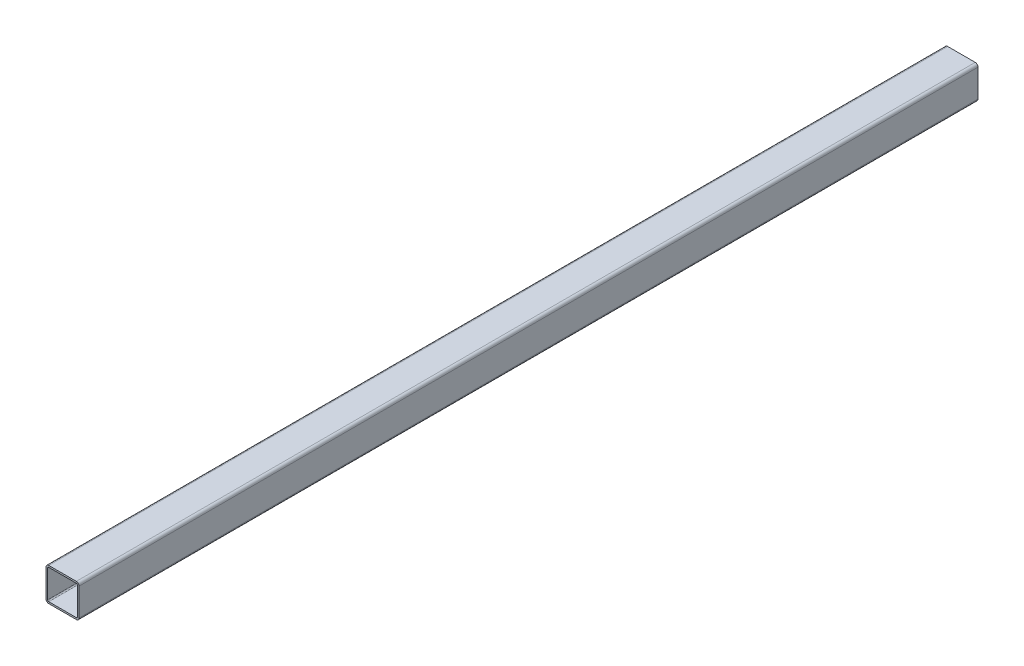
ISO-10303-21;
HEADER;
FILE_DESCRIPTION(('STEP AP214'),'2;1');
FILE_NAME('part.step','',(''),(''),'','','');
FILE_SCHEMA(('AUTOMOTIVE_DESIGN { 1 0 10303 214 1 1 1 1 }'));
ENDSEC;
DATA;
#1=APPLICATION_CONTEXT('core data for automotive mechanical design processes');
#2=APPLICATION_PROTOCOL_DEFINITION('international standard','automotive_design',2000,#1);
#3=PRODUCT_CONTEXT('',#1,'mechanical');
#4=PRODUCT('Part','Part','',(#3));
#5=PRODUCT_RELATED_PRODUCT_CATEGORY('part','',(#4));
#6=PRODUCT_DEFINITION_FORMATION('','',#4);
#7=PRODUCT_DEFINITION_CONTEXT('part definition',#1,'design');
#8=PRODUCT_DEFINITION('design','',#6,#7);
#9=PRODUCT_DEFINITION_SHAPE('','',#8);
#10=(LENGTH_UNIT() NAMED_UNIT(*) SI_UNIT(.MILLI.,.METRE.));
#11=(NAMED_UNIT(*) PLANE_ANGLE_UNIT() SI_UNIT($,.RADIAN.));
#12=(NAMED_UNIT(*) SI_UNIT($,.STERADIAN.) SOLID_ANGLE_UNIT());
#13=UNCERTAINTY_MEASURE_WITH_UNIT(LENGTH_MEASURE(1.E-05),#10,'distance_accuracy_value','');
#14=(GEOMETRIC_REPRESENTATION_CONTEXT(3) GLOBAL_UNCERTAINTY_ASSIGNED_CONTEXT((#13)) GLOBAL_UNIT_ASSIGNED_CONTEXT((#10,
#11,#12)) REPRESENTATION_CONTEXT('',''));
#15=CARTESIAN_POINT('',(0.,0.,0.));
#16=DIRECTION('',(0.,0.,1.));
#17=DIRECTION('',(1.,0.,0.));
#18=AXIS2_PLACEMENT_3D('',#15,#16,#17);
#19=CARTESIAN_POINT('',(25.,25.,815.));
#20=DIRECTION('',(0.,0.,-1.));
#21=DIRECTION('',(-1.,0.,0.));
#22=AXIS2_PLACEMENT_3D('',#19,#20,#21);
#23=PLANE('',#22);
#24=CARTESIAN_POINT('',(25.,25.,815.));
#25=DIRECTION('',(0.,0.,1.));
#26=DIRECTION('',(-1.,0.,0.));
#27=AXIS2_PLACEMENT_3D('',#24,#25,#26);
#28=CIRCLE('',#27,5.00000000000013);
#29=CARTESIAN_POINT('',(30.,25.,815.));
#30=VERTEX_POINT('',#29);
#31=CARTESIAN_POINT('',(24.9999999999995,30.0000000000002,815.));
#32=VERTEX_POINT('',#31);
#33=EDGE_CURVE('E198',#30,#32,#28,.T.);
#34=ORIENTED_EDGE('',*,*,#33,.T.);
#35=DIRECTION('',(-1.,0.,0.));
#36=VECTOR('',#35,1.);
#37=CARTESIAN_POINT('',(-24.9999999999995,30.0000000000002,815.));
#38=LINE('',#37,#36);
#39=CARTESIAN_POINT('',(-24.9999999999995,30.0000000000002,815.));
#40=VERTEX_POINT('',#39);
#41=EDGE_CURVE('E201',#32,#40,#38,.T.);
#42=ORIENTED_EDGE('',*,*,#41,.T.);
#43=CARTESIAN_POINT('',(-25.,25.,815.));
#44=DIRECTION('',(0.,0.,1.));
#45=DIRECTION('',(-1.,0.,0.));
#46=AXIS2_PLACEMENT_3D('',#43,#44,#45);
#47=CIRCLE('',#46,5.00000000000013);
#48=CARTESIAN_POINT('',(-30.0000000000001,25.,815.));
#49=VERTEX_POINT('',#48);
#50=EDGE_CURVE('E204',#40,#49,#47,.T.);
#51=ORIENTED_EDGE('',*,*,#50,.T.);
#52=DIRECTION('',(0.,-1.,0.));
#53=VECTOR('',#52,1.);
#54=CARTESIAN_POINT('',(-30.,-25.,815.));
#55=LINE('',#54,#53);
#56=CARTESIAN_POINT('',(-30.,-25.,815.));
#57=VERTEX_POINT('',#56);
#58=EDGE_CURVE('E206',#49,#57,#55,.T.);
#59=ORIENTED_EDGE('',*,*,#58,.T.);
#60=CARTESIAN_POINT('',(-25.,-25.,815.));
#61=DIRECTION('',(0.,0.,1.));
#62=DIRECTION('',(-1.,0.,0.));
#63=AXIS2_PLACEMENT_3D('',#60,#61,#62);
#64=CIRCLE('',#63,5.00000000000013);
#65=CARTESIAN_POINT('',(-24.9999999999995,-30.0000000000001,815.));
#66=VERTEX_POINT('',#65);
#67=EDGE_CURVE('E208',#57,#66,#64,.T.);
#68=ORIENTED_EDGE('',*,*,#67,.T.);
#69=DIRECTION('',(1.,0.,0.));
#70=VECTOR('',#69,1.);
#71=CARTESIAN_POINT('',(-24.9999999999995,-30.0000000000002,815.));
#72=LINE('',#71,#70);
#73=CARTESIAN_POINT('',(24.9999999999995,-30.0000000000002,815.));
#74=VERTEX_POINT('',#73);
#75=EDGE_CURVE('E210',#66,#74,#72,.T.);
#76=ORIENTED_EDGE('',*,*,#75,.T.);
#77=CARTESIAN_POINT('',(25.,-25.,815.));
#78=DIRECTION('',(0.,0.,1.));
#79=DIRECTION('',(1.,0.,0.));
#80=AXIS2_PLACEMENT_3D('',#77,#78,#79);
#81=CIRCLE('',#80,5.00000000000013);
#82=CARTESIAN_POINT('',(30.0000000000001,-25.,815.));
#83=VERTEX_POINT('',#82);
#84=EDGE_CURVE('E212',#74,#83,#81,.T.);
#85=ORIENTED_EDGE('',*,*,#84,.T.);
#86=DIRECTION('',(0.,1.,0.));
#87=VECTOR('',#86,1.);
#88=CARTESIAN_POINT('',(30.,-25.,815.));
#89=LINE('',#88,#87);
#90=EDGE_CURVE('E214',#83,#30,#89,.T.);
#91=ORIENTED_EDGE('',*,*,#90,.T.);
#92=EDGE_LOOP('',(#34,#42,#51,#59,#68,#76,#85,#91));
#93=FACE_BOUND('',#92,.T.);
#94=CARTESIAN_POINT('',(25.,25.,815.));
#95=DIRECTION('',(0.,0.,-1.));
#96=DIRECTION('',(-1.,0.,0.));
#97=AXIS2_PLACEMENT_3D('',#94,#95,#96);
#98=CIRCLE('',#97,2.00000000000013);
#99=CARTESIAN_POINT('',(27.,25.,815.));
#100=VERTEX_POINT('',#99);
#101=CARTESIAN_POINT('',(24.9999999999995,27.0000000000002,815.));
#102=VERTEX_POINT('',#101);
#103=EDGE_CURVE('E169',#100,#102,#98,.F.);
#104=ORIENTED_EDGE('',*,*,#103,.F.);
#105=DIRECTION('',(0.,1.,0.));
#106=VECTOR('',#105,1.);
#107=CARTESIAN_POINT('',(27.,25.,815.));
#108=LINE('',#107,#106);
#109=CARTESIAN_POINT('',(27.0000000000001,-25.,815.));
#110=VERTEX_POINT('',#109);
#111=EDGE_CURVE('E151',#110,#100,#108,.T.);
#112=ORIENTED_EDGE('',*,*,#111,.F.);
#113=CARTESIAN_POINT('',(25.,-25.,815.));
#114=DIRECTION('',(0.,0.,-1.));
#115=DIRECTION('',(-1.,0.,0.));
#116=AXIS2_PLACEMENT_3D('',#113,#114,#115);
#117=CIRCLE('',#116,2.00000000000013);
#118=CARTESIAN_POINT('',(24.9999999999995,-27.0000000000002,815.));
#119=VERTEX_POINT('',#118);
#120=EDGE_CURVE('E195',#119,#110,#117,.F.);
#121=ORIENTED_EDGE('',*,*,#120,.F.);
#122=DIRECTION('',(1.,0.,0.));
#123=VECTOR('',#122,1.);
#124=CARTESIAN_POINT('',(25.,-27.0000000000002,815.));
#125=LINE('',#124,#123);
#126=CARTESIAN_POINT('',(-24.9999999999998,-27.0000000000001,815.));
#127=VERTEX_POINT('',#126);
#128=EDGE_CURVE('E193',#127,#119,#125,.T.);
#129=ORIENTED_EDGE('',*,*,#128,.F.);
#130=CARTESIAN_POINT('',(-25.,-25.,815.));
#131=DIRECTION('',(0.,0.,-1.));
#132=DIRECTION('',(-1.,0.,0.));
#133=AXIS2_PLACEMENT_3D('',#130,#131,#132);
#134=CIRCLE('',#133,2.00000000000013);
#135=CARTESIAN_POINT('',(-27.,-25.,815.));
#136=VERTEX_POINT('',#135);
#137=EDGE_CURVE('E191',#136,#127,#134,.F.);
#138=ORIENTED_EDGE('',*,*,#137,.F.);
#139=DIRECTION('',(0.,-1.,0.));
#140=VECTOR('',#139,1.);
#141=CARTESIAN_POINT('',(-27.,25.,815.));
#142=LINE('',#141,#140);
#143=CARTESIAN_POINT('',(-27.0000000000001,25.,815.));
#144=VERTEX_POINT('',#143);
#145=EDGE_CURVE('E189',#144,#136,#142,.T.);
#146=ORIENTED_EDGE('',*,*,#145,.F.);
#147=CARTESIAN_POINT('',(-25.,25.,815.));
#148=DIRECTION('',(0.,0.,-1.));
#149=DIRECTION('',(-1.,0.,0.));
#150=AXIS2_PLACEMENT_3D('',#147,#148,#149);
#151=CIRCLE('',#150,2.00000000000013);
#152=CARTESIAN_POINT('',(-24.9999999999995,27.0000000000002,815.));
#153=VERTEX_POINT('',#152);
#154=EDGE_CURVE('E187',#153,#144,#151,.F.);
#155=ORIENTED_EDGE('',*,*,#154,.F.);
#156=DIRECTION('',(-1.,0.,0.));
#157=VECTOR('',#156,1.);
#158=CARTESIAN_POINT('',(25.,27.0000000000002,815.));
#159=LINE('',#158,#157);
#160=EDGE_CURVE('E171',#102,#153,#159,.T.);
#161=ORIENTED_EDGE('',*,*,#160,.F.);
#162=EDGE_LOOP('',(#104,#112,#121,#129,#138,#146,#155,#161));
#163=FACE_BOUND('',#162,.T.);
#164=ADVANCED_FACE('F32',(#93,#163),#23,.F.);
#165=CARTESIAN_POINT('',(25.,25.,-815.));
#166=DIRECTION('',(0.,0.,-1.));
#167=DIRECTION('',(-1.,0.,0.));
#168=AXIS2_PLACEMENT_3D('',#165,#166,#167);
#169=PLANE('',#168);
#170=CARTESIAN_POINT('',(25.,25.,-815.));
#171=DIRECTION('',(0.,0.,1.));
#172=DIRECTION('',(-1.,0.,0.));
#173=AXIS2_PLACEMENT_3D('',#170,#171,#172);
#174=CIRCLE('',#173,5.00000000000013);
#175=CARTESIAN_POINT('',(30.,25.,-815.));
#176=VERTEX_POINT('',#175);
#177=CARTESIAN_POINT('',(24.9999999999995,30.0000000000002,-815.));
#178=VERTEX_POINT('',#177);
#179=EDGE_CURVE('E217',#176,#178,#174,.T.);
#180=ORIENTED_EDGE('',*,*,#179,.F.);
#181=DIRECTION('',(0.,1.,0.));
#182=VECTOR('',#181,1.);
#183=CARTESIAN_POINT('',(30.,-25.,-815.));
#184=LINE('',#183,#182);
#185=CARTESIAN_POINT('',(30.0000000000001,-25.,-815.));
#186=VERTEX_POINT('',#185);
#187=EDGE_CURVE('E202',#186,#176,#184,.T.);
#188=ORIENTED_EDGE('',*,*,#187,.F.);
#189=CARTESIAN_POINT('',(25.,-25.,-815.));
#190=DIRECTION('',(0.,0.,1.));
#191=DIRECTION('',(1.,0.,0.));
#192=AXIS2_PLACEMENT_3D('',#189,#190,#191);
#193=CIRCLE('',#192,5.00000000000013);
#194=CARTESIAN_POINT('',(24.9999999999995,-30.0000000000002,-815.));
#195=VERTEX_POINT('',#194);
#196=EDGE_CURVE('E230',#195,#186,#193,.T.);
#197=ORIENTED_EDGE('',*,*,#196,.F.);
#198=DIRECTION('',(1.,0.,0.));
#199=VECTOR('',#198,1.);
#200=CARTESIAN_POINT('',(-24.9999999999995,-30.0000000000002,-815.));
#201=LINE('',#200,#199);
#202=CARTESIAN_POINT('',(-24.9999999999995,-30.0000000000001,-815.));
#203=VERTEX_POINT('',#202);
#204=EDGE_CURVE('E228',#203,#195,#201,.T.);
#205=ORIENTED_EDGE('',*,*,#204,.F.);
#206=CARTESIAN_POINT('',(-25.,-25.,-815.));
#207=DIRECTION('',(0.,0.,1.));
#208=DIRECTION('',(-1.,0.,0.));
#209=AXIS2_PLACEMENT_3D('',#206,#207,#208);
#210=CIRCLE('',#209,5.00000000000013);
#211=CARTESIAN_POINT('',(-30.,-25.,-815.));
#212=VERTEX_POINT('',#211);
#213=EDGE_CURVE('E226',#212,#203,#210,.T.);
#214=ORIENTED_EDGE('',*,*,#213,.F.);
#215=DIRECTION('',(0.,-1.,0.));
#216=VECTOR('',#215,1.);
#217=CARTESIAN_POINT('',(-30.,-25.,-815.));
#218=LINE('',#217,#216);
#219=CARTESIAN_POINT('',(-30.0000000000001,25.,-815.));
#220=VERTEX_POINT('',#219);
#221=EDGE_CURVE('E224',#220,#212,#218,.T.);
#222=ORIENTED_EDGE('',*,*,#221,.F.);
#223=CARTESIAN_POINT('',(-25.,25.,-815.));
#224=DIRECTION('',(0.,0.,1.));
#225=DIRECTION('',(-1.,0.,0.));
#226=AXIS2_PLACEMENT_3D('',#223,#224,#225);
#227=CIRCLE('',#226,5.00000000000013);
#228=CARTESIAN_POINT('',(-24.9999999999995,30.0000000000002,-815.));
#229=VERTEX_POINT('',#228);
#230=EDGE_CURVE('E222',#229,#220,#227,.T.);
#231=ORIENTED_EDGE('',*,*,#230,.F.);
#232=DIRECTION('',(-1.,0.,0.));
#233=VECTOR('',#232,1.);
#234=CARTESIAN_POINT('',(-24.9999999999995,30.0000000000002,-815.));
#235=LINE('',#234,#233);
#236=EDGE_CURVE('E220',#178,#229,#235,.T.);
#237=ORIENTED_EDGE('',*,*,#236,.F.);
#238=EDGE_LOOP('',(#180,#188,#197,#205,#214,#222,#231,#237));
#239=FACE_BOUND('',#238,.T.);
#240=DIRECTION('',(0.,1.,0.));
#241=VECTOR('',#240,1.);
#242=CARTESIAN_POINT('',(27.,25.,-815.));
#243=LINE('',#242,#241);
#244=CARTESIAN_POINT('',(27.0000000000001,-25.,-815.));
#245=VERTEX_POINT('',#244);
#246=CARTESIAN_POINT('',(27.,25.,-815.));
#247=VERTEX_POINT('',#246);
#248=EDGE_CURVE('E148',#245,#247,#243,.T.);
#249=ORIENTED_EDGE('',*,*,#248,.T.);
#250=CARTESIAN_POINT('',(25.,25.,-815.));
#251=DIRECTION('',(0.,0.,-1.));
#252=DIRECTION('',(-1.,0.,0.));
#253=AXIS2_PLACEMENT_3D('',#250,#251,#252);
#254=CIRCLE('',#253,2.00000000000013);
#255=CARTESIAN_POINT('',(24.9999999999995,27.0000000000002,-815.));
#256=VERTEX_POINT('',#255);
#257=EDGE_CURVE('E157',#247,#256,#254,.F.);
#258=ORIENTED_EDGE('',*,*,#257,.T.);
#259=DIRECTION('',(-1.,0.,0.));
#260=VECTOR('',#259,1.);
#261=CARTESIAN_POINT('',(25.,27.0000000000002,-815.));
#262=LINE('',#261,#260);
#263=CARTESIAN_POINT('',(-24.9999999999995,27.0000000000002,-815.));
#264=VERTEX_POINT('',#263);
#265=EDGE_CURVE('E163',#256,#264,#262,.T.);
#266=ORIENTED_EDGE('',*,*,#265,.T.);
#267=CARTESIAN_POINT('',(-25.,25.,-815.));
#268=DIRECTION('',(0.,0.,-1.));
#269=DIRECTION('',(-1.,0.,0.));
#270=AXIS2_PLACEMENT_3D('',#267,#268,#269);
#271=CIRCLE('',#270,2.00000000000013);
#272=CARTESIAN_POINT('',(-27.0000000000001,25.,-815.));
#273=VERTEX_POINT('',#272);
#274=EDGE_CURVE('E55',#264,#273,#271,.F.);
#275=ORIENTED_EDGE('',*,*,#274,.T.);
#276=DIRECTION('',(0.,-1.,0.));
#277=VECTOR('',#276,1.);
#278=CARTESIAN_POINT('',(-27.,25.,-815.));
#279=LINE('',#278,#277);
#280=CARTESIAN_POINT('',(-27.,-25.,-815.));
#281=VERTEX_POINT('',#280);
#282=EDGE_CURVE('E181',#273,#281,#279,.T.);
#283=ORIENTED_EDGE('',*,*,#282,.T.);
#284=CARTESIAN_POINT('',(-25.,-25.,-815.));
#285=DIRECTION('',(0.,0.,-1.));
#286=DIRECTION('',(-1.,0.,0.));
#287=AXIS2_PLACEMENT_3D('',#284,#285,#286);
#288=CIRCLE('',#287,2.00000000000013);
#289=CARTESIAN_POINT('',(-24.9999999999998,-27.0000000000001,-815.));
#290=VERTEX_POINT('',#289);
#291=EDGE_CURVE('E178',#281,#290,#288,.F.);
#292=ORIENTED_EDGE('',*,*,#291,.T.);
#293=DIRECTION('',(1.,0.,0.));
#294=VECTOR('',#293,1.);
#295=CARTESIAN_POINT('',(25.,-27.0000000000002,-815.));
#296=LINE('',#295,#294);
#297=CARTESIAN_POINT('',(24.9999999999995,-27.0000000000002,-815.));
#298=VERTEX_POINT('',#297);
#299=EDGE_CURVE('E173',#290,#298,#296,.T.);
#300=ORIENTED_EDGE('',*,*,#299,.T.);
#301=CARTESIAN_POINT('',(25.,-25.,-815.));
#302=DIRECTION('',(0.,0.,-1.));
#303=DIRECTION('',(-1.,0.,0.));
#304=AXIS2_PLACEMENT_3D('',#301,#302,#303);
#305=CIRCLE('',#304,2.00000000000013);
#306=EDGE_CURVE('E168',#298,#245,#305,.F.);
#307=ORIENTED_EDGE('',*,*,#306,.T.);
#308=EDGE_LOOP('',(#249,#258,#266,#275,#283,#292,#300,#307));
#309=FACE_BOUND('',#308,.T.);
#310=ADVANCED_FACE('F165',(#239,#309),#169,.T.);
#311=CARTESIAN_POINT('',(25.,25.,815.));
#312=DIRECTION('',(0.,0.,-1.));
#313=DIRECTION('',(-1.,0.,0.));
#314=AXIS2_PLACEMENT_3D('',#311,#312,#313);
#315=CYLINDRICAL_SURFACE('',#314,5.00000000000013);
#316=ORIENTED_EDGE('',*,*,#179,.T.);
#317=DIRECTION('',(0.,0.,-1.));
#318=VECTOR('',#317,1.);
#319=CARTESIAN_POINT('',(24.9999999999995,30.0000000000002,815.));
#320=LINE('',#319,#318);
#321=EDGE_CURVE('E11',#32,#178,#320,.T.);
#322=ORIENTED_EDGE('',*,*,#321,.F.);
#323=ORIENTED_EDGE('',*,*,#33,.F.);
#324=DIRECTION('',(0.,0.,-1.));
#325=VECTOR('',#324,1.);
#326=CARTESIAN_POINT('',(30.,25.,815.));
#327=LINE('',#326,#325);
#328=EDGE_CURVE('E216',#30,#176,#327,.T.);
#329=ORIENTED_EDGE('',*,*,#328,.T.);
#330=EDGE_LOOP('',(#316,#322,#323,#329));
#331=FACE_BOUND('',#330,.T.);
#332=ADVANCED_FACE('F34',(#331),#315,.T.);
#333=CARTESIAN_POINT('',(-24.9999999999995,30.0000000000002,815.));
#334=DIRECTION('',(0.,-1.,0.));
#335=DIRECTION('',(0.,0.,-1.));
#336=AXIS2_PLACEMENT_3D('',#333,#334,#335);
#337=PLANE('',#336);
#338=ORIENTED_EDGE('',*,*,#236,.T.);
#339=DIRECTION('',(0.,0.,-1.));
#340=VECTOR('',#339,1.);
#341=CARTESIAN_POINT('',(-24.9999999999995,30.0000000000002,815.));
#342=LINE('',#341,#340);
#343=EDGE_CURVE('E40',#40,#229,#342,.T.);
#344=ORIENTED_EDGE('',*,*,#343,.F.);
#345=ORIENTED_EDGE('',*,*,#41,.F.);
#346=ORIENTED_EDGE('',*,*,#321,.T.);
#347=EDGE_LOOP('',(#338,#344,#345,#346));
#348=FACE_BOUND('',#347,.T.);
#349=ADVANCED_FACE('F276',(#348),#337,.F.);
#350=CARTESIAN_POINT('',(-25.,25.,815.));
#351=DIRECTION('',(0.,0.,-1.));
#352=DIRECTION('',(-1.,0.,0.));
#353=AXIS2_PLACEMENT_3D('',#350,#351,#352);
#354=CYLINDRICAL_SURFACE('',#353,5.00000000000013);
#355=ORIENTED_EDGE('',*,*,#230,.T.);
#356=DIRECTION('',(0.,0.,-1.));
#357=VECTOR('',#356,1.);
#358=CARTESIAN_POINT('',(-30.0000000000001,25.,815.));
#359=LINE('',#358,#357);
#360=EDGE_CURVE('E247',#49,#220,#359,.T.);
#361=ORIENTED_EDGE('',*,*,#360,.F.);
#362=ORIENTED_EDGE('',*,*,#50,.F.);
#363=ORIENTED_EDGE('',*,*,#343,.T.);
#364=EDGE_LOOP('',(#355,#361,#362,#363));
#365=FACE_BOUND('',#364,.T.);
#366=ADVANCED_FACE('F254',(#365),#354,.T.);
#367=CARTESIAN_POINT('',(-30.,-25.,815.));
#368=DIRECTION('',(1.,0.,0.));
#369=DIRECTION('',(0.,0.,-1.));
#370=AXIS2_PLACEMENT_3D('',#367,#368,#369);
#371=PLANE('',#370);
#372=ORIENTED_EDGE('',*,*,#221,.T.);
#373=DIRECTION('',(0.,0.,-1.));
#374=VECTOR('',#373,1.);
#375=CARTESIAN_POINT('',(-30.,-25.,815.));
#376=LINE('',#375,#374);
#377=EDGE_CURVE('E244',#57,#212,#376,.T.);
#378=ORIENTED_EDGE('',*,*,#377,.F.);
#379=ORIENTED_EDGE('',*,*,#58,.F.);
#380=ORIENTED_EDGE('',*,*,#360,.T.);
#381=EDGE_LOOP('',(#372,#378,#379,#380));
#382=FACE_BOUND('',#381,.T.);
#383=ADVANCED_FACE('F264',(#382),#371,.F.);
#384=CARTESIAN_POINT('',(-25.,-25.,815.));
#385=DIRECTION('',(0.,0.,-1.));
#386=DIRECTION('',(-1.,0.,0.));
#387=AXIS2_PLACEMENT_3D('',#384,#385,#386);
#388=CYLINDRICAL_SURFACE('',#387,5.00000000000013);
#389=ORIENTED_EDGE('',*,*,#213,.T.);
#390=DIRECTION('',(0.,0.,-1.));
#391=VECTOR('',#390,1.);
#392=CARTESIAN_POINT('',(-24.9999999999995,-30.0000000000001,815.));
#393=LINE('',#392,#391);
#394=EDGE_CURVE('E241',#66,#203,#393,.T.);
#395=ORIENTED_EDGE('',*,*,#394,.F.);
#396=ORIENTED_EDGE('',*,*,#67,.F.);
#397=ORIENTED_EDGE('',*,*,#377,.T.);
#398=EDGE_LOOP('',(#389,#395,#396,#397));
#399=FACE_BOUND('',#398,.T.);
#400=ADVANCED_FACE('F268',(#399),#388,.T.);
#401=CARTESIAN_POINT('',(-24.9999999999995,-30.0000000000002,815.));
#402=DIRECTION('',(0.,1.,0.));
#403=DIRECTION('',(0.,0.,1.));
#404=AXIS2_PLACEMENT_3D('',#401,#402,#403);
#405=PLANE('',#404);
#406=ORIENTED_EDGE('',*,*,#204,.T.);
#407=DIRECTION('',(0.,0.,-1.));
#408=VECTOR('',#407,1.);
#409=CARTESIAN_POINT('',(24.9999999999995,-30.0000000000002,815.));
#410=LINE('',#409,#408);
#411=EDGE_CURVE('E238',#74,#195,#410,.T.);
#412=ORIENTED_EDGE('',*,*,#411,.F.);
#413=ORIENTED_EDGE('',*,*,#75,.F.);
#414=ORIENTED_EDGE('',*,*,#394,.T.);
#415=EDGE_LOOP('',(#406,#412,#413,#414));
#416=FACE_BOUND('',#415,.T.);
#417=ADVANCED_FACE('F289',(#416),#405,.F.);
#418=CARTESIAN_POINT('',(25.,-25.,815.));
#419=DIRECTION('',(0.,0.,-1.));
#420=DIRECTION('',(-1.,0.,0.));
#421=AXIS2_PLACEMENT_3D('',#418,#419,#420);
#422=CYLINDRICAL_SURFACE('',#421,5.00000000000013);
#423=ORIENTED_EDGE('',*,*,#196,.T.);
#424=DIRECTION('',(0.,0.,-1.));
#425=VECTOR('',#424,1.);
#426=CARTESIAN_POINT('',(30.0000000000001,-25.,815.));
#427=LINE('',#426,#425);
#428=EDGE_CURVE('E235',#83,#186,#427,.T.);
#429=ORIENTED_EDGE('',*,*,#428,.F.);
#430=ORIENTED_EDGE('',*,*,#84,.F.);
#431=ORIENTED_EDGE('',*,*,#411,.T.);
#432=EDGE_LOOP('',(#423,#429,#430,#431));
#433=FACE_BOUND('',#432,.T.);
#434=ADVANCED_FACE('F287',(#433),#422,.T.);
#435=CARTESIAN_POINT('',(30.,-25.,815.));
#436=DIRECTION('',(-1.,0.,0.));
#437=DIRECTION('',(0.,0.,1.));
#438=AXIS2_PLACEMENT_3D('',#435,#436,#437);
#439=PLANE('',#438);
#440=ORIENTED_EDGE('',*,*,#187,.T.);
#441=ORIENTED_EDGE('',*,*,#328,.F.);
#442=ORIENTED_EDGE('',*,*,#90,.F.);
#443=ORIENTED_EDGE('',*,*,#428,.T.);
#444=EDGE_LOOP('',(#440,#441,#442,#443));
#445=FACE_BOUND('',#444,.T.);
#446=ADVANCED_FACE('F282',(#445),#439,.F.);
#447=CARTESIAN_POINT('',(25.,25.,815.));
#448=DIRECTION('',(0.,0.,-1.));
#449=DIRECTION('',(-1.,0.,0.));
#450=AXIS2_PLACEMENT_3D('',#447,#448,#449);
#451=CYLINDRICAL_SURFACE('',#450,2.00000000000013);
#452=ORIENTED_EDGE('',*,*,#257,.F.);
#453=DIRECTION('',(0.,0.,-1.));
#454=VECTOR('',#453,1.);
#455=CARTESIAN_POINT('',(27.0000000000001,25.,815.));
#456=LINE('',#455,#454);
#457=EDGE_CURVE('E144',#100,#247,#456,.T.);
#458=ORIENTED_EDGE('',*,*,#457,.F.);
#459=ORIENTED_EDGE('',*,*,#103,.T.);
#460=DIRECTION('',(0.,0.,-1.));
#461=VECTOR('',#460,1.);
#462=CARTESIAN_POINT('',(24.9999999999995,27.0000000000002,815.));
#463=LINE('',#462,#461);
#464=EDGE_CURVE('E160',#102,#256,#463,.T.);
#465=ORIENTED_EDGE('',*,*,#464,.T.);
#466=EDGE_LOOP('',(#452,#458,#459,#465));
#467=FACE_BOUND('',#466,.T.);
#468=ADVANCED_FACE('F158',(#467),#451,.F.);
#469=CARTESIAN_POINT('',(-24.9999999999995,27.0000000000002,815.));
#470=DIRECTION('',(0.,-1.,0.));
#471=DIRECTION('',(0.,0.,-1.));
#472=AXIS2_PLACEMENT_3D('',#469,#470,#471);
#473=PLANE('',#472);
#474=ORIENTED_EDGE('',*,*,#265,.F.);
#475=ORIENTED_EDGE('',*,*,#464,.F.);
#476=ORIENTED_EDGE('',*,*,#160,.T.);
#477=DIRECTION('',(0.,0.,-1.));
#478=VECTOR('',#477,1.);
#479=CARTESIAN_POINT('',(-24.9999999999998,27.0000000000001,815.));
#480=LINE('',#479,#478);
#481=EDGE_CURVE('E354',#153,#264,#480,.T.);
#482=ORIENTED_EDGE('',*,*,#481,.T.);
#483=EDGE_LOOP('',(#474,#475,#476,#482));
#484=FACE_BOUND('',#483,.T.);
#485=ADVANCED_FACE('F311',(#484),#473,.T.);
#486=CARTESIAN_POINT('',(-25.,25.,815.));
#487=DIRECTION('',(0.,0.,-1.));
#488=DIRECTION('',(-1.,0.,0.));
#489=AXIS2_PLACEMENT_3D('',#486,#487,#488);
#490=CYLINDRICAL_SURFACE('',#489,2.00000000000013);
#491=ORIENTED_EDGE('',*,*,#274,.F.);
#492=ORIENTED_EDGE('',*,*,#481,.F.);
#493=ORIENTED_EDGE('',*,*,#154,.T.);
#494=DIRECTION('',(0.,0.,-1.));
#495=VECTOR('',#494,1.);
#496=CARTESIAN_POINT('',(-27.,25.,815.));
#497=LINE('',#496,#495);
#498=EDGE_CURVE('E352',#144,#273,#497,.T.);
#499=ORIENTED_EDGE('',*,*,#498,.T.);
#500=EDGE_LOOP('',(#491,#492,#493,#499));
#501=FACE_BOUND('',#500,.T.);
#502=ADVANCED_FACE('F316',(#501),#490,.F.);
#503=CARTESIAN_POINT('',(-27.,-25.,815.));
#504=DIRECTION('',(1.,0.,0.));
#505=DIRECTION('',(0.,0.,-1.));
#506=AXIS2_PLACEMENT_3D('',#503,#504,#505);
#507=PLANE('',#506);
#508=ORIENTED_EDGE('',*,*,#282,.F.);
#509=ORIENTED_EDGE('',*,*,#498,.F.);
#510=ORIENTED_EDGE('',*,*,#145,.T.);
#511=DIRECTION('',(0.,0.,-1.));
#512=VECTOR('',#511,1.);
#513=CARTESIAN_POINT('',(-27.0000000000001,-25.,815.));
#514=LINE('',#513,#512);
#515=EDGE_CURVE('E348',#136,#281,#514,.T.);
#516=ORIENTED_EDGE('',*,*,#515,.T.);
#517=EDGE_LOOP('',(#508,#509,#510,#516));
#518=FACE_BOUND('',#517,.T.);
#519=ADVANCED_FACE('F322',(#518),#507,.T.);
#520=CARTESIAN_POINT('',(-25.,-25.,815.));
#521=DIRECTION('',(0.,0.,-1.));
#522=DIRECTION('',(-1.,0.,0.));
#523=AXIS2_PLACEMENT_3D('',#520,#521,#522);
#524=CYLINDRICAL_SURFACE('',#523,2.00000000000013);
#525=ORIENTED_EDGE('',*,*,#291,.F.);
#526=ORIENTED_EDGE('',*,*,#515,.F.);
#527=ORIENTED_EDGE('',*,*,#137,.T.);
#528=DIRECTION('',(0.,0.,1.));
#529=VECTOR('',#528,1.);
#530=CARTESIAN_POINT('',(-24.9999999999995,-27.0000000000002,815.));
#531=LINE('',#530,#529);
#532=EDGE_CURVE('E345',#127,#290,#531,.F.);
#533=ORIENTED_EDGE('',*,*,#532,.T.);
#534=EDGE_LOOP('',(#525,#526,#527,#533));
#535=FACE_BOUND('',#534,.T.);
#536=ADVANCED_FACE('F325',(#535),#524,.F.);
#537=CARTESIAN_POINT('',(-24.9999999999995,-27.0000000000002,815.));
#538=DIRECTION('',(0.,1.,0.));
#539=DIRECTION('',(0.,0.,1.));
#540=AXIS2_PLACEMENT_3D('',#537,#538,#539);
#541=PLANE('',#540);
#542=ORIENTED_EDGE('',*,*,#299,.F.);
#543=ORIENTED_EDGE('',*,*,#532,.F.);
#544=ORIENTED_EDGE('',*,*,#128,.T.);
#545=DIRECTION('',(0.,0.,-1.));
#546=VECTOR('',#545,1.);
#547=CARTESIAN_POINT('',(24.9999999999998,-27.0000000000001,815.));
#548=LINE('',#547,#546);
#549=EDGE_CURVE('E340',#119,#298,#548,.T.);
#550=ORIENTED_EDGE('',*,*,#549,.T.);
#551=EDGE_LOOP('',(#542,#543,#544,#550));
#552=FACE_BOUND('',#551,.T.);
#553=ADVANCED_FACE('F329',(#552),#541,.T.);
#554=CARTESIAN_POINT('',(25.,-25.,815.));
#555=DIRECTION('',(0.,0.,-1.));
#556=DIRECTION('',(-1.,0.,0.));
#557=AXIS2_PLACEMENT_3D('',#554,#555,#556);
#558=CYLINDRICAL_SURFACE('',#557,2.00000000000013);
#559=ORIENTED_EDGE('',*,*,#306,.F.);
#560=ORIENTED_EDGE('',*,*,#549,.F.);
#561=ORIENTED_EDGE('',*,*,#120,.T.);
#562=DIRECTION('',(0.,0.,1.));
#563=VECTOR('',#562,1.);
#564=CARTESIAN_POINT('',(27.,-25.,815.));
#565=LINE('',#564,#563);
#566=EDGE_CURVE('E47',#110,#245,#565,.F.);
#567=ORIENTED_EDGE('',*,*,#566,.T.);
#568=EDGE_LOOP('',(#559,#560,#561,#567));
#569=FACE_BOUND('',#568,.T.);
#570=ADVANCED_FACE('F332',(#569),#558,.F.);
#571=CARTESIAN_POINT('',(27.,-25.,815.));
#572=DIRECTION('',(-1.,0.,0.));
#573=DIRECTION('',(0.,0.,1.));
#574=AXIS2_PLACEMENT_3D('',#571,#572,#573);
#575=PLANE('',#574);
#576=ORIENTED_EDGE('',*,*,#248,.F.);
#577=ORIENTED_EDGE('',*,*,#566,.F.);
#578=ORIENTED_EDGE('',*,*,#111,.T.);
#579=ORIENTED_EDGE('',*,*,#457,.T.);
#580=EDGE_LOOP('',(#576,#577,#578,#579));
#581=FACE_BOUND('',#580,.T.);
#582=ADVANCED_FACE('F146',(#581),#575,.T.);
#583=CLOSED_SHELL('',(#164,#310,#332,#349,#366,#383,#400,#417,#434,#446,#468,#485,#502,#519,
#536,#553,#570,#582));
#584=MANIFOLD_SOLID_BREP('B2',#583);
#585=ADVANCED_BREP_SHAPE_REPRESENTATION('',(#18,#584),#14);
#586=SHAPE_DEFINITION_REPRESENTATION(#9,#585);
ENDSEC;
END-ISO-10303-21;
